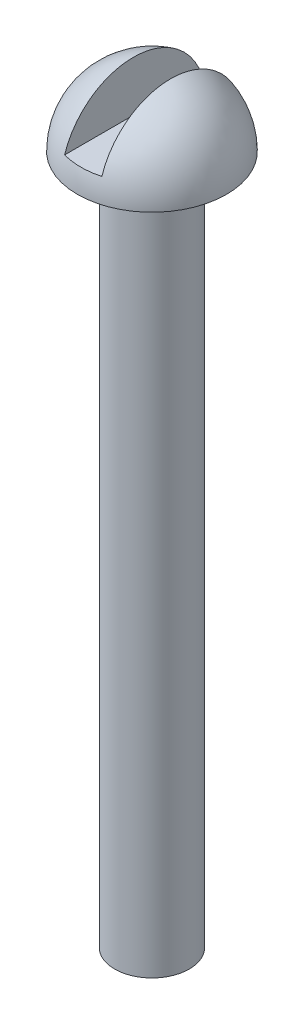
ISO-10303-21;
HEADER;
FILE_DESCRIPTION(('STEP AP214'),'2;1');
FILE_NAME('part.step','',(''),(''),'','','');
FILE_SCHEMA(('AUTOMOTIVE_DESIGN { 1 0 10303 214 1 1 1 1 }'));
ENDSEC;
DATA;
#1=APPLICATION_CONTEXT('core data for automotive mechanical design processes');
#2=APPLICATION_PROTOCOL_DEFINITION('international standard','automotive_design',2000,#1);
#3=PRODUCT_CONTEXT('',#1,'mechanical');
#4=PRODUCT('Part','Part','',(#3));
#5=PRODUCT_RELATED_PRODUCT_CATEGORY('part','',(#4));
#6=PRODUCT_DEFINITION_FORMATION('','',#4);
#7=PRODUCT_DEFINITION_CONTEXT('part definition',#1,'design');
#8=PRODUCT_DEFINITION('design','',#6,#7);
#9=PRODUCT_DEFINITION_SHAPE('','',#8);
#10=(LENGTH_UNIT() NAMED_UNIT(*) SI_UNIT(.MILLI.,.METRE.));
#11=(NAMED_UNIT(*) PLANE_ANGLE_UNIT() SI_UNIT($,.RADIAN.));
#12=(NAMED_UNIT(*) SI_UNIT($,.STERADIAN.) SOLID_ANGLE_UNIT());
#13=UNCERTAINTY_MEASURE_WITH_UNIT(LENGTH_MEASURE(1.E-05),#10,'distance_accuracy_value','');
#14=(GEOMETRIC_REPRESENTATION_CONTEXT(3) GLOBAL_UNCERTAINTY_ASSIGNED_CONTEXT((#13)) GLOBAL_UNIT_ASSIGNED_CONTEXT((#10,
#11,#12)) REPRESENTATION_CONTEXT('',''));
#15=CARTESIAN_POINT('',(0.,0.,0.));
#16=DIRECTION('',(0.,0.,1.));
#17=DIRECTION('',(1.,0.,0.));
#18=AXIS2_PLACEMENT_3D('',#15,#16,#17);
#19=CARTESIAN_POINT('',(0.,37.,0.));
#20=DIRECTION('',(0.,-1.,0.));
#21=DIRECTION('',(0.,0.,-1.));
#22=AXIS2_PLACEMENT_3D('',#19,#20,#21);
#23=CYLINDRICAL_SURFACE('',#22,2.);
#24=CARTESIAN_POINT('',(0.,37.,0.));
#25=DIRECTION('',(0.,1.,0.));
#26=DIRECTION('',(0.,0.,1.));
#27=AXIS2_PLACEMENT_3D('',#24,#25,#26);
#28=CIRCLE('',#27,2.);
#29=CARTESIAN_POINT('',(0.,37.,2.));
#30=VERTEX_POINT('',#29);
#31=EDGE_CURVE('E68',#30,#30,#28,.T.);
#32=ORIENTED_EDGE('',*,*,#31,.F.);
#33=EDGE_LOOP('',(#32));
#34=FACE_BOUND('',#33,.T.);
#35=CARTESIAN_POINT('',(0.,0.,0.));
#36=DIRECTION('',(0.,1.,0.));
#37=DIRECTION('',(0.,0.,1.));
#38=AXIS2_PLACEMENT_3D('',#35,#36,#37);
#39=CIRCLE('',#38,2.);
#40=CARTESIAN_POINT('',(0.,0.,2.));
#41=VERTEX_POINT('',#40);
#42=EDGE_CURVE('E76',#41,#41,#39,.T.);
#43=ORIENTED_EDGE('',*,*,#42,.T.);
#44=EDGE_LOOP('',(#43));
#45=FACE_BOUND('',#44,.T.);
#46=ADVANCED_FACE('F37',(#34,#45),#23,.T.);
#47=CARTESIAN_POINT('',(0.,0.,0.));
#48=DIRECTION('',(0.,1.,0.));
#49=DIRECTION('',(0.,0.,1.));
#50=AXIS2_PLACEMENT_3D('',#47,#48,#49);
#51=PLANE('',#50);
#52=ORIENTED_EDGE('',*,*,#42,.F.);
#53=EDGE_LOOP('',(#52));
#54=FACE_BOUND('',#53,.T.);
#55=ADVANCED_FACE('F97',(#54),#51,.F.);
#56=CARTESIAN_POINT('',(0.,37.,0.));
#57=DIRECTION('',(0.,1.,0.));
#58=DIRECTION('',(1.,0.,0.));
#59=AXIS2_PLACEMENT_3D('',#56,#57,#58);
#60=SPHERICAL_SURFACE('',#59,4.);
#61=CARTESIAN_POINT('',(0.,38.18,0.));
#62=DIRECTION('',(0.,-1.,0.));
#63=DIRECTION('',(0.,0.,-1.));
#64=AXIS2_PLACEMENT_3D('',#61,#62,#63);
#65=CIRCLE('',#64,3.82198901097321);
#66=CARTESIAN_POINT('',(-1.,38.18,-3.68884805867631));
#67=VERTEX_POINT('',#66);
#68=CARTESIAN_POINT('',(1.,38.18,-3.68884805867631));
#69=VERTEX_POINT('',#68);
#70=EDGE_CURVE('E67',#67,#69,#65,.T.);
#71=ORIENTED_EDGE('',*,*,#70,.T.);
#72=CARTESIAN_POINT('',(1.,37.,0.));
#73=DIRECTION('',(1.,0.,0.));
#74=DIRECTION('',(0.,1.,0.));
#75=AXIS2_PLACEMENT_3D('',#72,#73,#74);
#76=CIRCLE('',#75,3.87298334620742);
#77=CARTESIAN_POINT('',(1.,38.18,3.68884805867631));
#78=VERTEX_POINT('',#77);
#79=EDGE_CURVE('E11',#69,#78,#76,.T.);
#80=ORIENTED_EDGE('',*,*,#79,.T.);
#81=CARTESIAN_POINT('',(-1.,38.18,3.68884805867631));
#82=VERTEX_POINT('',#81);
#83=EDGE_CURVE('E44',#78,#82,#65,.T.);
#84=ORIENTED_EDGE('',*,*,#83,.T.);
#85=CARTESIAN_POINT('',(-1.,37.,0.));
#86=DIRECTION('',(-1.,0.,0.));
#87=DIRECTION('',(0.,-1.,0.));
#88=AXIS2_PLACEMENT_3D('',#85,#86,#87);
#89=CIRCLE('',#88,3.87298334620742);
#90=EDGE_CURVE('E63',#82,#67,#89,.T.);
#91=ORIENTED_EDGE('',*,*,#90,.T.);
#92=EDGE_LOOP('',(#71,#80,#84,#91));
#93=FACE_BOUND('',#92,.T.);
#94=CARTESIAN_POINT('',(0.,37.,0.));
#95=DIRECTION('',(0.,1.,0.));
#96=DIRECTION('',(0.,0.,1.));
#97=AXIS2_PLACEMENT_3D('',#94,#95,#96);
#98=CIRCLE('',#97,4.);
#99=CARTESIAN_POINT('',(0.,37.,4.));
#100=VERTEX_POINT('',#99);
#101=EDGE_CURVE('E79',#100,#100,#98,.T.);
#102=ORIENTED_EDGE('',*,*,#101,.T.);
#103=EDGE_LOOP('',(#102));
#104=FACE_BOUND('',#103,.T.);
#105=ADVANCED_FACE('F73',(#93,#104),#60,.T.);
#106=CARTESIAN_POINT('',(0.,37.,0.));
#107=DIRECTION('',(0.,1.,0.));
#108=DIRECTION('',(0.,0.,1.));
#109=AXIS2_PLACEMENT_3D('',#106,#107,#108);
#110=PLANE('',#109);
#111=ORIENTED_EDGE('',*,*,#31,.T.);
#112=EDGE_LOOP('',(#111));
#113=FACE_BOUND('',#112,.T.);
#114=ORIENTED_EDGE('',*,*,#101,.F.);
#115=EDGE_LOOP('',(#114));
#116=FACE_BOUND('',#115,.T.);
#117=ADVANCED_FACE('F87',(#113,#116),#110,.F.);
#118=CARTESIAN_POINT('',(1.,38.18,-4.));
#119=DIRECTION('',(1.,0.,0.));
#120=DIRECTION('',(0.,1.,0.));
#121=AXIS2_PLACEMENT_3D('',#118,#119,#120);
#122=PLANE('',#121);
#123=DIRECTION('',(0.,0.,1.));
#124=VECTOR('',#123,1.);
#125=CARTESIAN_POINT('',(1.,38.18,-4.));
#126=LINE('',#125,#124);
#127=EDGE_CURVE('E71',#69,#78,#126,.T.);
#128=ORIENTED_EDGE('',*,*,#127,.T.);
#129=ORIENTED_EDGE('',*,*,#79,.F.);
#130=EDGE_LOOP('',(#128,#129));
#131=FACE_BOUND('',#130,.T.);
#132=ADVANCED_FACE('F85',(#131),#122,.F.);
#133=CARTESIAN_POINT('',(-1.,38.18,-4.));
#134=DIRECTION('',(0.,-1.,0.));
#135=DIRECTION('',(0.,0.,-1.));
#136=AXIS2_PLACEMENT_3D('',#133,#134,#135);
#137=PLANE('',#136);
#138=ORIENTED_EDGE('',*,*,#127,.F.);
#139=ORIENTED_EDGE('',*,*,#70,.F.);
#140=DIRECTION('',(0.,0.,1.));
#141=VECTOR('',#140,1.);
#142=CARTESIAN_POINT('',(-1.,38.18,-4.));
#143=LINE('',#142,#141);
#144=EDGE_CURVE('E50',#67,#82,#143,.T.);
#145=ORIENTED_EDGE('',*,*,#144,.T.);
#146=ORIENTED_EDGE('',*,*,#83,.F.);
#147=EDGE_LOOP('',(#138,#139,#145,#146));
#148=FACE_BOUND('',#147,.T.);
#149=ADVANCED_FACE('F70',(#148),#137,.F.);
#150=CARTESIAN_POINT('',(-1.,41.3066375960518,-4.));
#151=DIRECTION('',(-1.,0.,0.));
#152=DIRECTION('',(0.,-1.,0.));
#153=AXIS2_PLACEMENT_3D('',#150,#151,#152);
#154=PLANE('',#153);
#155=ORIENTED_EDGE('',*,*,#144,.F.);
#156=ORIENTED_EDGE('',*,*,#90,.F.);
#157=EDGE_LOOP('',(#155,#156));
#158=FACE_BOUND('',#157,.T.);
#159=ADVANCED_FACE('F64',(#158),#154,.F.);
#160=CLOSED_SHELL('',(#46,#55,#105,#117,#132,#149,#159));
#161=MANIFOLD_SOLID_BREP('B2',#160);
#162=ADVANCED_BREP_SHAPE_REPRESENTATION('',(#18,#161),#14);
#163=SHAPE_DEFINITION_REPRESENTATION(#9,#162);
ENDSEC;
END-ISO-10303-21;
